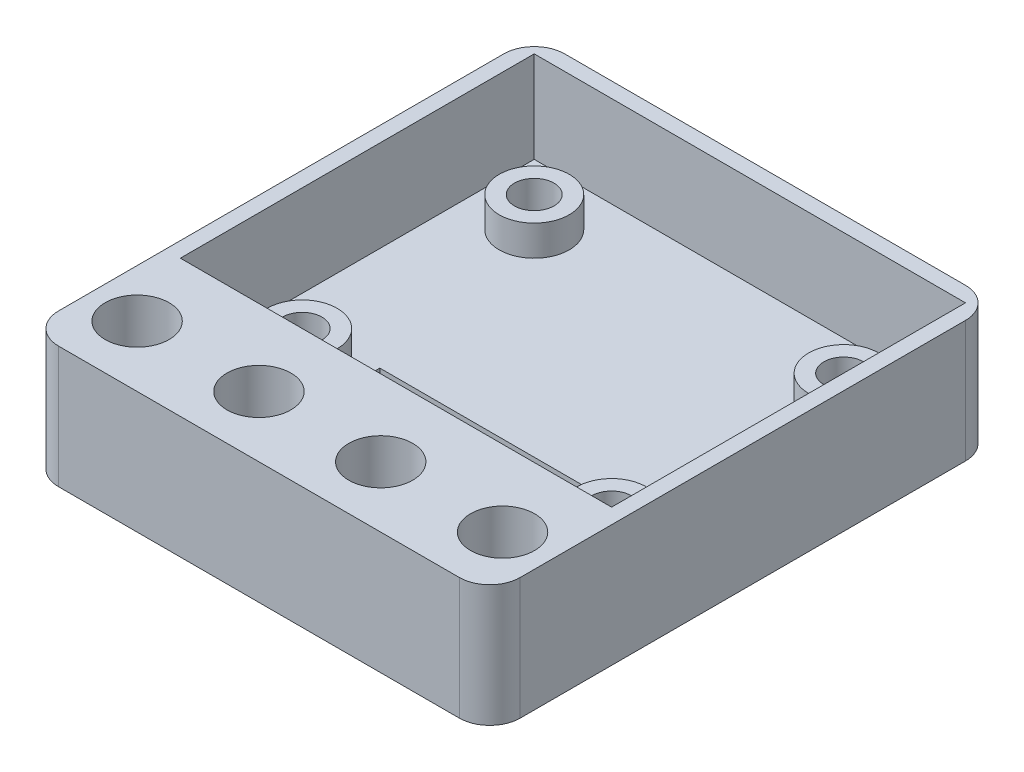
ISO-10303-21;
HEADER;
FILE_DESCRIPTION(('STEP AP214'),'2;1');
FILE_NAME('part.step','',(''),(''),'','','');
FILE_SCHEMA(('AUTOMOTIVE_DESIGN { 1 0 10303 214 1 1 1 1 }'));
ENDSEC;
DATA;
#1=APPLICATION_CONTEXT('core data for automotive mechanical design processes');
#2=APPLICATION_PROTOCOL_DEFINITION('international standard','automotive_design',2000,#1);
#3=PRODUCT_CONTEXT('',#1,'mechanical');
#4=PRODUCT('Part','Part','',(#3));
#5=PRODUCT_RELATED_PRODUCT_CATEGORY('part','',(#4));
#6=PRODUCT_DEFINITION_FORMATION('','',#4);
#7=PRODUCT_DEFINITION_CONTEXT('part definition',#1,'design');
#8=PRODUCT_DEFINITION('design','',#6,#7);
#9=PRODUCT_DEFINITION_SHAPE('','',#8);
#10=(LENGTH_UNIT() NAMED_UNIT(*) SI_UNIT(.MILLI.,.METRE.));
#11=(NAMED_UNIT(*) PLANE_ANGLE_UNIT() SI_UNIT($,.RADIAN.));
#12=(NAMED_UNIT(*) SI_UNIT($,.STERADIAN.) SOLID_ANGLE_UNIT());
#13=UNCERTAINTY_MEASURE_WITH_UNIT(LENGTH_MEASURE(1.E-05),#10,'distance_accuracy_value','');
#14=(GEOMETRIC_REPRESENTATION_CONTEXT(3) GLOBAL_UNCERTAINTY_ASSIGNED_CONTEXT((#13)) GLOBAL_UNIT_ASSIGNED_CONTEXT((#10,
#11,#12)) REPRESENTATION_CONTEXT('',''));
#15=CARTESIAN_POINT('',(0.,0.,0.));
#16=DIRECTION('',(0.,0.,1.));
#17=DIRECTION('',(1.,0.,0.));
#18=AXIS2_PLACEMENT_3D('',#15,#16,#17);
#19=CARTESIAN_POINT('',(0.,2.,9.92));
#20=DIRECTION('',(0.,0.,1.));
#21=DIRECTION('',(1.,0.,0.));
#22=AXIS2_PLACEMENT_3D('',#19,#20,#21);
#23=PLANE('',#22);
#24=DIRECTION('',(-1.,0.,0.));
#25=VECTOR('',#24,1.);
#26=CARTESIAN_POINT('',(0.,0.,9.92));
#27=LINE('',#26,#25);
#28=CARTESIAN_POINT('',(7.36,0.,9.92));
#29=VERTEX_POINT('',#28);
#30=CARTESIAN_POINT('',(-7.36,0.,9.92));
#31=VERTEX_POINT('',#30);
#32=EDGE_CURVE('E295',#29,#31,#27,.T.);
#33=ORIENTED_EDGE('',*,*,#32,.T.);
#34=DIRECTION('',(0.,-1.,0.));
#35=VECTOR('',#34,1.);
#36=CARTESIAN_POINT('',(-7.36,2.,9.92));
#37=LINE('',#36,#35);
#38=CARTESIAN_POINT('',(-7.36,2.,9.92));
#39=VERTEX_POINT('',#38);
#40=EDGE_CURVE('E367',#39,#31,#37,.T.);
#41=ORIENTED_EDGE('',*,*,#40,.F.);
#42=DIRECTION('',(-1.,0.,0.));
#43=VECTOR('',#42,1.);
#44=CARTESIAN_POINT('',(0.,2.,9.92));
#45=LINE('',#44,#43);
#46=CARTESIAN_POINT('',(7.36,2.,9.92));
#47=VERTEX_POINT('',#46);
#48=EDGE_CURVE('E329',#47,#39,#45,.T.);
#49=ORIENTED_EDGE('',*,*,#48,.F.);
#50=DIRECTION('',(0.,-1.,0.));
#51=VECTOR('',#50,1.);
#52=CARTESIAN_POINT('',(7.36,2.,9.92));
#53=LINE('',#52,#51);
#54=EDGE_CURVE('E344',#47,#29,#53,.T.);
#55=ORIENTED_EDGE('',*,*,#54,.T.);
#56=EDGE_LOOP('',(#33,#41,#49,#55));
#57=FACE_BOUND('',#56,.T.);
#58=ADVANCED_FACE('F41',(#57),#23,.F.);
#59=CARTESIAN_POINT('',(-7.36,2.,0.));
#60=DIRECTION('',(-1.,0.,0.));
#61=DIRECTION('',(0.,0.,1.));
#62=AXIS2_PLACEMENT_3D('',#59,#60,#61);
#63=PLANE('',#62);
#64=DIRECTION('',(0.,0.,-1.));
#65=VECTOR('',#64,1.);
#66=CARTESIAN_POINT('',(-7.36,0.,0.));
#67=LINE('',#66,#65);
#68=CARTESIAN_POINT('',(-7.36,0.,5.32));
#69=VERTEX_POINT('',#68);
#70=EDGE_CURVE('E348',#31,#69,#67,.T.);
#71=ORIENTED_EDGE('',*,*,#70,.T.);
#72=DIRECTION('',(0.,-1.,0.));
#73=VECTOR('',#72,1.);
#74=CARTESIAN_POINT('',(-7.36,2.,5.32));
#75=LINE('',#74,#73);
#76=CARTESIAN_POINT('',(-7.36,2.,5.32));
#77=VERTEX_POINT('',#76);
#78=EDGE_CURVE('E364',#77,#69,#75,.T.);
#79=ORIENTED_EDGE('',*,*,#78,.F.);
#80=DIRECTION('',(0.,0.,-1.));
#81=VECTOR('',#80,1.);
#82=CARTESIAN_POINT('',(-7.36,2.,0.));
#83=LINE('',#82,#81);
#84=EDGE_CURVE('E333',#39,#77,#83,.T.);
#85=ORIENTED_EDGE('',*,*,#84,.F.);
#86=ORIENTED_EDGE('',*,*,#40,.T.);
#87=EDGE_LOOP('',(#71,#79,#85,#86));
#88=FACE_BOUND('',#87,.T.);
#89=ADVANCED_FACE('F455',(#88),#63,.F.);
#90=CARTESIAN_POINT('',(0.,2.,5.32));
#91=DIRECTION('',(0.,0.,1.));
#92=DIRECTION('',(1.,0.,0.));
#93=AXIS2_PLACEMENT_3D('',#90,#91,#92);
#94=PLANE('',#93);
#95=DIRECTION('',(-1.,0.,0.));
#96=VECTOR('',#95,1.);
#97=CARTESIAN_POINT('',(0.,0.,5.32));
#98=LINE('',#97,#96);
#99=CARTESIAN_POINT('',(7.36,0.,5.32));
#100=VERTEX_POINT('',#99);
#101=EDGE_CURVE('E352',#100,#69,#98,.T.);
#102=ORIENTED_EDGE('',*,*,#101,.F.);
#103=DIRECTION('',(0.,-1.,0.));
#104=VECTOR('',#103,1.);
#105=CARTESIAN_POINT('',(7.36,2.,5.32));
#106=LINE('',#105,#104);
#107=CARTESIAN_POINT('',(7.36,2.,5.32));
#108=VERTEX_POINT('',#107);
#109=EDGE_CURVE('E361',#108,#100,#106,.T.);
#110=ORIENTED_EDGE('',*,*,#109,.F.);
#111=DIRECTION('',(-1.,0.,0.));
#112=VECTOR('',#111,1.);
#113=CARTESIAN_POINT('',(0.,2.,5.32));
#114=LINE('',#113,#112);
#115=EDGE_CURVE('E336',#108,#77,#114,.T.);
#116=ORIENTED_EDGE('',*,*,#115,.T.);
#117=ORIENTED_EDGE('',*,*,#78,.T.);
#118=EDGE_LOOP('',(#102,#110,#116,#117));
#119=FACE_BOUND('',#118,.T.);
#120=ADVANCED_FACE('F461',(#119),#94,.T.);
#121=CARTESIAN_POINT('',(7.36,2.,0.));
#122=DIRECTION('',(-1.,0.,0.));
#123=DIRECTION('',(0.,0.,1.));
#124=AXIS2_PLACEMENT_3D('',#121,#122,#123);
#125=PLANE('',#124);
#126=DIRECTION('',(0.,0.,-1.));
#127=VECTOR('',#126,1.);
#128=CARTESIAN_POINT('',(7.36,0.,0.));
#129=LINE('',#128,#127);
#130=EDGE_CURVE('E304',#29,#100,#129,.T.);
#131=ORIENTED_EDGE('',*,*,#130,.F.);
#132=ORIENTED_EDGE('',*,*,#54,.F.);
#133=DIRECTION('',(0.,0.,-1.));
#134=VECTOR('',#133,1.);
#135=CARTESIAN_POINT('',(7.36,2.,0.));
#136=LINE('',#135,#134);
#137=EDGE_CURVE('E340',#47,#108,#136,.T.);
#138=ORIENTED_EDGE('',*,*,#137,.T.);
#139=ORIENTED_EDGE('',*,*,#109,.T.);
#140=EDGE_LOOP('',(#131,#132,#138,#139));
#141=FACE_BOUND('',#140,.T.);
#142=ADVANCED_FACE('F467',(#141),#125,.T.);
#143=CARTESIAN_POINT('',(0.,2.,0.));
#144=DIRECTION('',(0.,1.,0.));
#145=DIRECTION('',(0.,0.,1.));
#146=AXIS2_PLACEMENT_3D('',#143,#144,#145);
#147=PLANE('',#146);
#148=CARTESIAN_POINT('',(10.16,2.,7.62));
#149=DIRECTION('',(0.,1.,0.));
#150=DIRECTION('',(0.,0.,1.));
#151=AXIS2_PLACEMENT_3D('',#148,#149,#150);
#152=CIRCLE('',#151,2.3);
#153=CARTESIAN_POINT('',(10.16,2.,9.92));
#154=VERTEX_POINT('',#153);
#155=EDGE_CURVE('E299',#154,#154,#152,.T.);
#156=ORIENTED_EDGE('',*,*,#155,.F.);
#157=EDGE_LOOP('',(#156));
#158=FACE_BOUND('',#157,.T.);
#159=CARTESIAN_POINT('',(10.16,2.,-7.62));
#160=DIRECTION('',(0.,1.,0.));
#161=DIRECTION('',(0.,0.,1.));
#162=AXIS2_PLACEMENT_3D('',#159,#160,#161);
#163=CIRCLE('',#162,2.3);
#164=CARTESIAN_POINT('',(10.16,2.,-5.32));
#165=VERTEX_POINT('',#164);
#166=EDGE_CURVE('E303',#165,#165,#163,.T.);
#167=ORIENTED_EDGE('',*,*,#166,.F.);
#168=EDGE_LOOP('',(#167));
#169=FACE_BOUND('',#168,.T.);
#170=CARTESIAN_POINT('',(-10.16,2.,7.62));
#171=DIRECTION('',(0.,1.,0.));
#172=DIRECTION('',(0.,0.,1.));
#173=AXIS2_PLACEMENT_3D('',#170,#171,#172);
#174=CIRCLE('',#173,2.3);
#175=CARTESIAN_POINT('',(-10.16,2.,9.92));
#176=VERTEX_POINT('',#175);
#177=EDGE_CURVE('E308',#176,#176,#174,.T.);
#178=ORIENTED_EDGE('',*,*,#177,.F.);
#179=EDGE_LOOP('',(#178));
#180=FACE_BOUND('',#179,.T.);
#181=CARTESIAN_POINT('',(-10.16,2.,-7.62));
#182=DIRECTION('',(0.,1.,0.));
#183=DIRECTION('',(0.,0.,1.));
#184=AXIS2_PLACEMENT_3D('',#181,#182,#183);
#185=CIRCLE('',#184,2.3);
#186=CARTESIAN_POINT('',(-10.16,2.,-5.32));
#187=VERTEX_POINT('',#186);
#188=EDGE_CURVE('E312',#187,#187,#185,.T.);
#189=ORIENTED_EDGE('',*,*,#188,.F.);
#190=EDGE_LOOP('',(#189));
#191=FACE_BOUND('',#190,.T.);
#192=DIRECTION('',(-1.,0.,0.));
#193=VECTOR('',#192,1.);
#194=CARTESIAN_POINT('',(0.,2.,11.62));
#195=LINE('',#194,#193);
#196=CARTESIAN_POINT('',(14.16,2.,11.62));
#197=VERTEX_POINT('',#196);
#198=CARTESIAN_POINT('',(-14.16,2.,11.62));
#199=VERTEX_POINT('',#198);
#200=EDGE_CURVE('E316',#197,#199,#195,.T.);
#201=ORIENTED_EDGE('',*,*,#200,.F.);
#202=DIRECTION('',(0.,0.,-1.));
#203=VECTOR('',#202,1.);
#204=CARTESIAN_POINT('',(14.16,2.,0.));
#205=LINE('',#204,#203);
#206=CARTESIAN_POINT('',(14.16,2.,-11.62));
#207=VERTEX_POINT('',#206);
#208=EDGE_CURVE('E164',#197,#207,#205,.T.);
#209=ORIENTED_EDGE('',*,*,#208,.T.);
#210=DIRECTION('',(-1.,0.,0.));
#211=VECTOR('',#210,1.);
#212=CARTESIAN_POINT('',(0.,2.,-11.62));
#213=LINE('',#212,#211);
#214=CARTESIAN_POINT('',(-14.16,2.,-11.62));
#215=VERTEX_POINT('',#214);
#216=EDGE_CURVE('E321',#207,#215,#213,.T.);
#217=ORIENTED_EDGE('',*,*,#216,.T.);
#218=DIRECTION('',(0.,0.,-1.));
#219=VECTOR('',#218,1.);
#220=CARTESIAN_POINT('',(-14.16,2.,0.));
#221=LINE('',#220,#219);
#222=EDGE_CURVE('E325',#199,#215,#221,.T.);
#223=ORIENTED_EDGE('',*,*,#222,.F.);
#224=EDGE_LOOP('',(#201,#209,#217,#223));
#225=FACE_BOUND('',#224,.T.);
#226=ORIENTED_EDGE('',*,*,#48,.T.);
#227=ORIENTED_EDGE('',*,*,#84,.T.);
#228=ORIENTED_EDGE('',*,*,#115,.F.);
#229=ORIENTED_EDGE('',*,*,#137,.F.);
#230=EDGE_LOOP('',(#226,#227,#228,#229));
#231=FACE_BOUND('',#230,.T.);
#232=ADVANCED_FACE('F471',(#158,#169,#180,#191,#225,#231),#147,.T.);
#233=CARTESIAN_POINT('',(0.,0.,0.));
#234=DIRECTION('',(0.,1.,0.));
#235=DIRECTION('',(0.,0.,1.));
#236=AXIS2_PLACEMENT_3D('',#233,#234,#235);
#237=PLANE('',#236);
#238=ORIENTED_EDGE('',*,*,#32,.F.);
#239=ORIENTED_EDGE('',*,*,#130,.T.);
#240=ORIENTED_EDGE('',*,*,#101,.T.);
#241=ORIENTED_EDGE('',*,*,#70,.F.);
#242=EDGE_LOOP('',(#238,#239,#240,#241));
#243=FACE_BOUND('',#242,.T.);
#244=CARTESIAN_POINT('',(-10.16,0.,7.62));
#245=DIRECTION('',(0.,1.,0.));
#246=DIRECTION('',(0.,0.,1.));
#247=AXIS2_PLACEMENT_3D('',#244,#245,#246);
#248=CIRCLE('',#247,1.3);
#249=CARTESIAN_POINT('',(-10.16,0.,8.92));
#250=VERTEX_POINT('',#249);
#251=EDGE_CURVE('E283',#250,#250,#248,.T.);
#252=ORIENTED_EDGE('',*,*,#251,.T.);
#253=EDGE_LOOP('',(#252));
#254=FACE_BOUND('',#253,.T.);
#255=CARTESIAN_POINT('',(10.16,0.,7.62));
#256=DIRECTION('',(0.,1.,0.));
#257=DIRECTION('',(0.,0.,1.));
#258=AXIS2_PLACEMENT_3D('',#255,#256,#257);
#259=CIRCLE('',#258,1.3);
#260=CARTESIAN_POINT('',(10.16,0.,8.92));
#261=VERTEX_POINT('',#260);
#262=EDGE_CURVE('E271',#261,#261,#259,.T.);
#263=ORIENTED_EDGE('',*,*,#262,.T.);
#264=EDGE_LOOP('',(#263));
#265=FACE_BOUND('',#264,.T.);
#266=CARTESIAN_POINT('',(10.16,0.,-7.62));
#267=DIRECTION('',(0.,1.,0.));
#268=DIRECTION('',(0.,0.,1.));
#269=AXIS2_PLACEMENT_3D('',#266,#267,#268);
#270=CIRCLE('',#269,1.3);
#271=CARTESIAN_POINT('',(10.16,0.,-6.32));
#272=VERTEX_POINT('',#271);
#273=EDGE_CURVE('E259',#272,#272,#270,.T.);
#274=ORIENTED_EDGE('',*,*,#273,.T.);
#275=EDGE_LOOP('',(#274));
#276=FACE_BOUND('',#275,.T.);
#277=CARTESIAN_POINT('',(-10.16,0.,-7.62));
#278=DIRECTION('',(0.,1.,0.));
#279=DIRECTION('',(0.,0.,1.));
#280=AXIS2_PLACEMENT_3D('',#277,#278,#279);
#281=CIRCLE('',#280,1.3);
#282=CARTESIAN_POINT('',(-10.16,0.,-6.32));
#283=VERTEX_POINT('',#282);
#284=EDGE_CURVE('E168',#283,#283,#281,.T.);
#285=ORIENTED_EDGE('',*,*,#284,.T.);
#286=EDGE_LOOP('',(#285));
#287=FACE_BOUND('',#286,.T.);
#288=CARTESIAN_POINT('',(12.,0.,16.62));
#289=DIRECTION('',(0.,1.,0.));
#290=DIRECTION('',(0.,0.,1.));
#291=AXIS2_PLACEMENT_3D('',#288,#289,#290);
#292=CIRCLE('',#291,2.1);
#293=CARTESIAN_POINT('',(12.,0.,18.72));
#294=VERTEX_POINT('',#293);
#295=EDGE_CURVE('E211',#294,#294,#292,.T.);
#296=ORIENTED_EDGE('',*,*,#295,.T.);
#297=EDGE_LOOP('',(#296));
#298=FACE_BOUND('',#297,.T.);
#299=CARTESIAN_POINT('',(4.,0.,16.62));
#300=DIRECTION('',(0.,1.,0.));
#301=DIRECTION('',(0.,0.,1.));
#302=AXIS2_PLACEMENT_3D('',#299,#300,#301);
#303=CIRCLE('',#302,2.1);
#304=CARTESIAN_POINT('',(4.,0.,18.72));
#305=VERTEX_POINT('',#304);
#306=EDGE_CURVE('E215',#305,#305,#303,.T.);
#307=ORIENTED_EDGE('',*,*,#306,.T.);
#308=EDGE_LOOP('',(#307));
#309=FACE_BOUND('',#308,.T.);
#310=CARTESIAN_POINT('',(-4.,0.,16.62));
#311=DIRECTION('',(0.,1.,0.));
#312=DIRECTION('',(0.,0.,1.));
#313=AXIS2_PLACEMENT_3D('',#310,#311,#312);
#314=CIRCLE('',#313,2.1);
#315=CARTESIAN_POINT('',(-4.,0.,18.72));
#316=VERTEX_POINT('',#315);
#317=EDGE_CURVE('E219',#316,#316,#314,.T.);
#318=ORIENTED_EDGE('',*,*,#317,.T.);
#319=EDGE_LOOP('',(#318));
#320=FACE_BOUND('',#319,.T.);
#321=CARTESIAN_POINT('',(-12.,0.,16.62));
#322=DIRECTION('',(0.,1.,0.));
#323=DIRECTION('',(0.,0.,1.));
#324=AXIS2_PLACEMENT_3D('',#321,#322,#323);
#325=CIRCLE('',#324,2.1);
#326=CARTESIAN_POINT('',(-12.,0.,18.72));
#327=VERTEX_POINT('',#326);
#328=EDGE_CURVE('E223',#327,#327,#325,.T.);
#329=ORIENTED_EDGE('',*,*,#328,.T.);
#330=EDGE_LOOP('',(#329));
#331=FACE_BOUND('',#330,.T.);
#332=DIRECTION('',(0.,0.,-1.));
#333=VECTOR('',#332,1.);
#334=CARTESIAN_POINT('',(15.16,0.,0.));
#335=LINE('',#334,#333);
#336=CARTESIAN_POINT('',(15.16,0.,18.62));
#337=VERTEX_POINT('',#336);
#338=CARTESIAN_POINT('',(15.16,0.,-10.62));
#339=VERTEX_POINT('',#338);
#340=EDGE_CURVE('E231',#337,#339,#335,.T.);
#341=ORIENTED_EDGE('',*,*,#340,.F.);
#342=CARTESIAN_POINT('',(13.16,0.,18.62));
#343=DIRECTION('',(0.,1.,0.));
#344=DIRECTION('',(0.,0.,1.));
#345=AXIS2_PLACEMENT_3D('',#342,#343,#344);
#346=CIRCLE('',#345,2.);
#347=CARTESIAN_POINT('',(13.16,0.,20.62));
#348=VERTEX_POINT('',#347);
#349=EDGE_CURVE('E387',#337,#348,#346,.F.);
#350=ORIENTED_EDGE('',*,*,#349,.T.);
#351=DIRECTION('',(1.,0.,0.));
#352=VECTOR('',#351,1.);
#353=CARTESIAN_POINT('',(0.,0.,20.62));
#354=LINE('',#353,#352);
#355=CARTESIAN_POINT('',(-13.16,0.,20.62));
#356=VERTEX_POINT('',#355);
#357=EDGE_CURVE('E227',#356,#348,#354,.T.);
#358=ORIENTED_EDGE('',*,*,#357,.F.);
#359=CARTESIAN_POINT('',(-13.16,0.,18.62));
#360=DIRECTION('',(0.,1.,0.));
#361=DIRECTION('',(0.,0.,1.));
#362=AXIS2_PLACEMENT_3D('',#359,#360,#361);
#363=CIRCLE('',#362,2.);
#364=CARTESIAN_POINT('',(-15.16,0.,18.62));
#365=VERTEX_POINT('',#364);
#366=EDGE_CURVE('E378',#356,#365,#363,.F.);
#367=ORIENTED_EDGE('',*,*,#366,.T.);
#368=DIRECTION('',(0.,0.,-1.));
#369=VECTOR('',#368,1.);
#370=CARTESIAN_POINT('',(-15.16,0.,0.));
#371=LINE('',#370,#369);
#372=CARTESIAN_POINT('',(-15.16,0.,-10.62));
#373=VERTEX_POINT('',#372);
#374=EDGE_CURVE('E239',#365,#373,#371,.T.);
#375=ORIENTED_EDGE('',*,*,#374,.T.);
#376=CARTESIAN_POINT('',(-13.16,0.,-10.62));
#377=DIRECTION('',(0.,1.,0.));
#378=DIRECTION('',(0.,0.,1.));
#379=AXIS2_PLACEMENT_3D('',#376,#377,#378);
#380=CIRCLE('',#379,2.);
#381=CARTESIAN_POINT('',(-13.16,0.,-12.62));
#382=VERTEX_POINT('',#381);
#383=EDGE_CURVE('E381',#373,#382,#380,.F.);
#384=ORIENTED_EDGE('',*,*,#383,.T.);
#385=DIRECTION('',(-1.,0.,0.));
#386=VECTOR('',#385,1.);
#387=CARTESIAN_POINT('',(0.,0.,-12.62));
#388=LINE('',#387,#386);
#389=CARTESIAN_POINT('',(13.16,0.,-12.62));
#390=VERTEX_POINT('',#389);
#391=EDGE_CURVE('E235',#390,#382,#388,.T.);
#392=ORIENTED_EDGE('',*,*,#391,.F.);
#393=CARTESIAN_POINT('',(13.16,0.,-10.62));
#394=DIRECTION('',(0.,1.,0.));
#395=DIRECTION('',(0.,0.,1.));
#396=AXIS2_PLACEMENT_3D('',#393,#394,#395);
#397=CIRCLE('',#396,2.);
#398=EDGE_CURVE('E384',#390,#339,#397,.F.);
#399=ORIENTED_EDGE('',*,*,#398,.T.);
#400=EDGE_LOOP('',(#341,#350,#358,#367,#375,#384,#392,#399));
#401=FACE_BOUND('',#400,.T.);
#402=ADVANCED_FACE('F425',(#243,#254,#265,#276,#287,#298,#309,#320,#331,#401),#237,.F.);
#403=CARTESIAN_POINT('',(-10.16,4.,7.62));
#404=DIRECTION('',(0.,-1.,0.));
#405=DIRECTION('',(0.,0.,-1.));
#406=AXIS2_PLACEMENT_3D('',#403,#404,#405);
#407=CYLINDRICAL_SURFACE('',#406,1.3);
#408=CARTESIAN_POINT('',(-10.16,4.,7.62));
#409=DIRECTION('',(0.,1.,0.));
#410=DIRECTION('',(0.,0.,1.));
#411=AXIS2_PLACEMENT_3D('',#408,#409,#410);
#412=CIRCLE('',#411,1.3);
#413=CARTESIAN_POINT('',(-10.16,4.,8.92));
#414=VERTEX_POINT('',#413);
#415=EDGE_CURVE('E287',#414,#414,#412,.T.);
#416=ORIENTED_EDGE('',*,*,#415,.T.);
#417=EDGE_LOOP('',(#416));
#418=FACE_BOUND('',#417,.T.);
#419=ORIENTED_EDGE('',*,*,#251,.F.);
#420=EDGE_LOOP('',(#419));
#421=FACE_BOUND('',#420,.T.);
#422=ADVANCED_FACE('F475',(#418,#421),#407,.F.);
#423=CARTESIAN_POINT('',(-10.16,4.,7.62));
#424=DIRECTION('',(0.,-1.,0.));
#425=DIRECTION('',(0.,0.,-1.));
#426=AXIS2_PLACEMENT_3D('',#423,#424,#425);
#427=CYLINDRICAL_SURFACE('',#426,2.3);
#428=ORIENTED_EDGE('',*,*,#177,.T.);
#429=EDGE_LOOP('',(#428));
#430=FACE_BOUND('',#429,.T.);
#431=CARTESIAN_POINT('',(-10.16,4.,7.62));
#432=DIRECTION('',(0.,1.,0.));
#433=DIRECTION('',(0.,0.,1.));
#434=AXIS2_PLACEMENT_3D('',#431,#432,#433);
#435=CIRCLE('',#434,2.3);
#436=CARTESIAN_POINT('',(-10.16,4.,9.92));
#437=VERTEX_POINT('',#436);
#438=EDGE_CURVE('E291',#437,#437,#435,.T.);
#439=ORIENTED_EDGE('',*,*,#438,.F.);
#440=EDGE_LOOP('',(#439));
#441=FACE_BOUND('',#440,.T.);
#442=ADVANCED_FACE('F482',(#430,#441),#427,.T.);
#443=CARTESIAN_POINT('',(0.,4.,0.));
#444=DIRECTION('',(0.,1.,0.));
#445=DIRECTION('',(0.,0.,1.));
#446=AXIS2_PLACEMENT_3D('',#443,#444,#445);
#447=PLANE('',#446);
#448=ORIENTED_EDGE('',*,*,#415,.F.);
#449=EDGE_LOOP('',(#448));
#450=FACE_BOUND('',#449,.T.);
#451=ORIENTED_EDGE('',*,*,#438,.T.);
#452=EDGE_LOOP('',(#451));
#453=FACE_BOUND('',#452,.T.);
#454=ADVANCED_FACE('F486',(#450,#453),#447,.T.);
#455=CARTESIAN_POINT('',(10.16,4.,7.62));
#456=DIRECTION('',(0.,-1.,0.));
#457=DIRECTION('',(0.,0.,-1.));
#458=AXIS2_PLACEMENT_3D('',#455,#456,#457);
#459=CYLINDRICAL_SURFACE('',#458,1.3);
#460=CARTESIAN_POINT('',(10.16,4.,7.62));
#461=DIRECTION('',(0.,1.,0.));
#462=DIRECTION('',(0.,0.,1.));
#463=AXIS2_PLACEMENT_3D('',#460,#461,#462);
#464=CIRCLE('',#463,1.3);
#465=CARTESIAN_POINT('',(10.16,4.,8.92));
#466=VERTEX_POINT('',#465);
#467=EDGE_CURVE('E275',#466,#466,#464,.T.);
#468=ORIENTED_EDGE('',*,*,#467,.T.);
#469=EDGE_LOOP('',(#468));
#470=FACE_BOUND('',#469,.T.);
#471=ORIENTED_EDGE('',*,*,#262,.F.);
#472=EDGE_LOOP('',(#471));
#473=FACE_BOUND('',#472,.T.);
#474=ADVANCED_FACE('F490',(#470,#473),#459,.F.);
#475=CARTESIAN_POINT('',(10.16,4.,7.62));
#476=DIRECTION('',(0.,-1.,0.));
#477=DIRECTION('',(0.,0.,-1.));
#478=AXIS2_PLACEMENT_3D('',#475,#476,#477);
#479=CYLINDRICAL_SURFACE('',#478,2.3);
#480=ORIENTED_EDGE('',*,*,#155,.T.);
#481=EDGE_LOOP('',(#480));
#482=FACE_BOUND('',#481,.T.);
#483=CARTESIAN_POINT('',(10.16,4.,7.62));
#484=DIRECTION('',(0.,1.,0.));
#485=DIRECTION('',(0.,0.,1.));
#486=AXIS2_PLACEMENT_3D('',#483,#484,#485);
#487=CIRCLE('',#486,2.3);
#488=CARTESIAN_POINT('',(10.16,4.,9.92));
#489=VERTEX_POINT('',#488);
#490=EDGE_CURVE('E279',#489,#489,#487,.T.);
#491=ORIENTED_EDGE('',*,*,#490,.F.);
#492=EDGE_LOOP('',(#491));
#493=FACE_BOUND('',#492,.T.);
#494=ADVANCED_FACE('F494',(#482,#493),#479,.T.);
#495=CARTESIAN_POINT('',(0.,4.,0.));
#496=DIRECTION('',(0.,1.,0.));
#497=DIRECTION('',(0.,0.,1.));
#498=AXIS2_PLACEMENT_3D('',#495,#496,#497);
#499=PLANE('',#498);
#500=ORIENTED_EDGE('',*,*,#467,.F.);
#501=EDGE_LOOP('',(#500));
#502=FACE_BOUND('',#501,.T.);
#503=ORIENTED_EDGE('',*,*,#490,.T.);
#504=EDGE_LOOP('',(#503));
#505=FACE_BOUND('',#504,.T.);
#506=ADVANCED_FACE('F498',(#502,#505),#499,.T.);
#507=CARTESIAN_POINT('',(10.16,4.,-7.62));
#508=DIRECTION('',(0.,-1.,0.));
#509=DIRECTION('',(0.,0.,-1.));
#510=AXIS2_PLACEMENT_3D('',#507,#508,#509);
#511=CYLINDRICAL_SURFACE('',#510,1.3);
#512=CARTESIAN_POINT('',(10.16,4.,-7.62));
#513=DIRECTION('',(0.,1.,0.));
#514=DIRECTION('',(0.,0.,1.));
#515=AXIS2_PLACEMENT_3D('',#512,#513,#514);
#516=CIRCLE('',#515,1.3);
#517=CARTESIAN_POINT('',(10.16,4.,-6.32));
#518=VERTEX_POINT('',#517);
#519=EDGE_CURVE('E263',#518,#518,#516,.T.);
#520=ORIENTED_EDGE('',*,*,#519,.T.);
#521=EDGE_LOOP('',(#520));
#522=FACE_BOUND('',#521,.T.);
#523=ORIENTED_EDGE('',*,*,#273,.F.);
#524=EDGE_LOOP('',(#523));
#525=FACE_BOUND('',#524,.T.);
#526=ADVANCED_FACE('F502',(#522,#525),#511,.F.);
#527=CARTESIAN_POINT('',(10.16,4.,-7.62));
#528=DIRECTION('',(0.,-1.,0.));
#529=DIRECTION('',(0.,0.,-1.));
#530=AXIS2_PLACEMENT_3D('',#527,#528,#529);
#531=CYLINDRICAL_SURFACE('',#530,2.3);
#532=ORIENTED_EDGE('',*,*,#166,.T.);
#533=EDGE_LOOP('',(#532));
#534=FACE_BOUND('',#533,.T.);
#535=CARTESIAN_POINT('',(10.16,4.,-7.62));
#536=DIRECTION('',(0.,1.,0.));
#537=DIRECTION('',(0.,0.,1.));
#538=AXIS2_PLACEMENT_3D('',#535,#536,#537);
#539=CIRCLE('',#538,2.3);
#540=CARTESIAN_POINT('',(10.16,4.,-5.32));
#541=VERTEX_POINT('',#540);
#542=EDGE_CURVE('E267',#541,#541,#539,.T.);
#543=ORIENTED_EDGE('',*,*,#542,.F.);
#544=EDGE_LOOP('',(#543));
#545=FACE_BOUND('',#544,.T.);
#546=ADVANCED_FACE('F506',(#534,#545),#531,.T.);
#547=CARTESIAN_POINT('',(0.,4.,0.));
#548=DIRECTION('',(0.,1.,0.));
#549=DIRECTION('',(0.,0.,1.));
#550=AXIS2_PLACEMENT_3D('',#547,#548,#549);
#551=PLANE('',#550);
#552=ORIENTED_EDGE('',*,*,#519,.F.);
#553=EDGE_LOOP('',(#552));
#554=FACE_BOUND('',#553,.T.);
#555=ORIENTED_EDGE('',*,*,#542,.T.);
#556=EDGE_LOOP('',(#555));
#557=FACE_BOUND('',#556,.T.);
#558=ADVANCED_FACE('F510',(#554,#557),#551,.T.);
#559=CARTESIAN_POINT('',(-10.16,4.,-7.62));
#560=DIRECTION('',(0.,-1.,0.));
#561=DIRECTION('',(0.,0.,-1.));
#562=AXIS2_PLACEMENT_3D('',#559,#560,#561);
#563=CYLINDRICAL_SURFACE('',#562,1.3);
#564=CARTESIAN_POINT('',(-10.16,4.,-7.62));
#565=DIRECTION('',(0.,1.,0.));
#566=DIRECTION('',(0.,0.,1.));
#567=AXIS2_PLACEMENT_3D('',#564,#565,#566);
#568=CIRCLE('',#567,1.3);
#569=CARTESIAN_POINT('',(-10.16,4.,-6.32));
#570=VERTEX_POINT('',#569);
#571=EDGE_CURVE('E251',#570,#570,#568,.T.);
#572=ORIENTED_EDGE('',*,*,#571,.T.);
#573=EDGE_LOOP('',(#572));
#574=FACE_BOUND('',#573,.T.);
#575=ORIENTED_EDGE('',*,*,#284,.F.);
#576=EDGE_LOOP('',(#575));
#577=FACE_BOUND('',#576,.T.);
#578=ADVANCED_FACE('F514',(#574,#577),#563,.F.);
#579=CARTESIAN_POINT('',(-10.16,4.,-7.62));
#580=DIRECTION('',(0.,-1.,0.));
#581=DIRECTION('',(0.,0.,-1.));
#582=AXIS2_PLACEMENT_3D('',#579,#580,#581);
#583=CYLINDRICAL_SURFACE('',#582,2.3);
#584=ORIENTED_EDGE('',*,*,#188,.T.);
#585=EDGE_LOOP('',(#584));
#586=FACE_BOUND('',#585,.T.);
#587=CARTESIAN_POINT('',(-10.16,4.,-7.62));
#588=DIRECTION('',(0.,1.,0.));
#589=DIRECTION('',(0.,0.,1.));
#590=AXIS2_PLACEMENT_3D('',#587,#588,#589);
#591=CIRCLE('',#590,2.3);
#592=CARTESIAN_POINT('',(-10.16,4.,-5.32));
#593=VERTEX_POINT('',#592);
#594=EDGE_CURVE('E255',#593,#593,#591,.T.);
#595=ORIENTED_EDGE('',*,*,#594,.F.);
#596=EDGE_LOOP('',(#595));
#597=FACE_BOUND('',#596,.T.);
#598=ADVANCED_FACE('F518',(#586,#597),#583,.T.);
#599=CARTESIAN_POINT('',(0.,4.,0.));
#600=DIRECTION('',(0.,1.,0.));
#601=DIRECTION('',(0.,0.,1.));
#602=AXIS2_PLACEMENT_3D('',#599,#600,#601);
#603=PLANE('',#602);
#604=ORIENTED_EDGE('',*,*,#571,.F.);
#605=EDGE_LOOP('',(#604));
#606=FACE_BOUND('',#605,.T.);
#607=ORIENTED_EDGE('',*,*,#594,.T.);
#608=EDGE_LOOP('',(#607));
#609=FACE_BOUND('',#608,.T.);
#610=ADVANCED_FACE('F522',(#606,#609),#603,.T.);
#611=CARTESIAN_POINT('',(0.,8.,20.62));
#612=DIRECTION('',(0.,0.,-1.));
#613=DIRECTION('',(-1.,0.,0.));
#614=AXIS2_PLACEMENT_3D('',#611,#612,#613);
#615=PLANE('',#614);
#616=ORIENTED_EDGE('',*,*,#357,.T.);
#617=DIRECTION('',(0.,-1.,0.));
#618=VECTOR('',#617,1.);
#619=CARTESIAN_POINT('',(13.16,8.,20.62));
#620=LINE('',#619,#618);
#621=CARTESIAN_POINT('',(13.16,8.,20.62));
#622=VERTEX_POINT('',#621);
#623=EDGE_CURVE('E394',#348,#622,#620,.F.);
#624=ORIENTED_EDGE('',*,*,#623,.T.);
#625=DIRECTION('',(1.,0.,0.));
#626=VECTOR('',#625,1.);
#627=CARTESIAN_POINT('',(0.,8.,20.62));
#628=LINE('',#627,#626);
#629=CARTESIAN_POINT('',(-13.16,8.,20.62));
#630=VERTEX_POINT('',#629);
#631=EDGE_CURVE('E196',#630,#622,#628,.T.);
#632=ORIENTED_EDGE('',*,*,#631,.F.);
#633=DIRECTION('',(0.,-1.,0.));
#634=VECTOR('',#633,1.);
#635=CARTESIAN_POINT('',(-13.16,0.,20.62));
#636=LINE('',#635,#634);
#637=EDGE_CURVE('E390',#630,#356,#636,.T.);
#638=ORIENTED_EDGE('',*,*,#637,.T.);
#639=EDGE_LOOP('',(#616,#624,#632,#638));
#640=FACE_BOUND('',#639,.T.);
#641=ADVANCED_FACE('F436',(#640),#615,.F.);
#642=CARTESIAN_POINT('',(15.16,8.,0.));
#643=DIRECTION('',(-1.,0.,0.));
#644=DIRECTION('',(0.,0.,1.));
#645=AXIS2_PLACEMENT_3D('',#642,#643,#644);
#646=PLANE('',#645);
#647=DIRECTION('',(0.,0.,-1.));
#648=VECTOR('',#647,1.);
#649=CARTESIAN_POINT('',(15.16,8.,0.));
#650=LINE('',#649,#648);
#651=CARTESIAN_POINT('',(15.16,8.,18.62));
#652=VERTEX_POINT('',#651);
#653=CARTESIAN_POINT('',(15.16,8.,-10.62));
#654=VERTEX_POINT('',#653);
#655=EDGE_CURVE('E200',#652,#654,#650,.T.);
#656=ORIENTED_EDGE('',*,*,#655,.F.);
#657=DIRECTION('',(0.,-1.,0.));
#658=VECTOR('',#657,1.);
#659=CARTESIAN_POINT('',(15.16,8.,18.62));
#660=LINE('',#659,#658);
#661=EDGE_CURVE('E374',#652,#337,#660,.T.);
#662=ORIENTED_EDGE('',*,*,#661,.T.);
#663=ORIENTED_EDGE('',*,*,#340,.T.);
#664=DIRECTION('',(0.,-1.,0.));
#665=VECTOR('',#664,1.);
#666=CARTESIAN_POINT('',(15.16,8.,-10.62));
#667=LINE('',#666,#665);
#668=EDGE_CURVE('E371',#339,#654,#667,.F.);
#669=ORIENTED_EDGE('',*,*,#668,.T.);
#670=EDGE_LOOP('',(#656,#662,#663,#669));
#671=FACE_BOUND('',#670,.T.);
#672=ADVANCED_FACE('F444',(#671),#646,.F.);
#673=CARTESIAN_POINT('',(0.,8.,-12.62));
#674=DIRECTION('',(0.,0.,1.));
#675=DIRECTION('',(1.,0.,0.));
#676=AXIS2_PLACEMENT_3D('',#673,#674,#675);
#677=PLANE('',#676);
#678=DIRECTION('',(-1.,0.,0.));
#679=VECTOR('',#678,1.);
#680=CARTESIAN_POINT('',(0.,8.,-12.62));
#681=LINE('',#680,#679);
#682=CARTESIAN_POINT('',(13.16,8.,-12.62));
#683=VERTEX_POINT('',#682);
#684=CARTESIAN_POINT('',(-13.16,8.,-12.62));
#685=VERTEX_POINT('',#684);
#686=EDGE_CURVE('E204',#683,#685,#681,.T.);
#687=ORIENTED_EDGE('',*,*,#686,.F.);
#688=DIRECTION('',(0.,-1.,0.));
#689=VECTOR('',#688,1.);
#690=CARTESIAN_POINT('',(13.16,8.,-12.62));
#691=LINE('',#690,#689);
#692=EDGE_CURVE('E411',#683,#390,#691,.T.);
#693=ORIENTED_EDGE('',*,*,#692,.T.);
#694=ORIENTED_EDGE('',*,*,#391,.T.);
#695=DIRECTION('',(0.,-1.,0.));
#696=VECTOR('',#695,1.);
#697=CARTESIAN_POINT('',(-13.16,8.,-12.62));
#698=LINE('',#697,#696);
#699=EDGE_CURVE('E408',#382,#685,#698,.F.);
#700=ORIENTED_EDGE('',*,*,#699,.T.);
#701=EDGE_LOOP('',(#687,#693,#694,#700));
#702=FACE_BOUND('',#701,.T.);
#703=ADVANCED_FACE('F419',(#702),#677,.F.);
#704=CARTESIAN_POINT('',(14.16,8.,0.));
#705=DIRECTION('',(-1.,0.,0.));
#706=DIRECTION('',(0.,0.,1.));
#707=AXIS2_PLACEMENT_3D('',#704,#705,#706);
#708=PLANE('',#707);
#709=DIRECTION('',(0.,-1.,0.));
#710=VECTOR('',#709,1.);
#711=CARTESIAN_POINT('',(14.16,8.,-11.62));
#712=LINE('',#711,#710);
#713=CARTESIAN_POINT('',(14.16,8.,-11.62));
#714=VERTEX_POINT('',#713);
#715=EDGE_CURVE('E210',#714,#207,#712,.T.);
#716=ORIENTED_EDGE('',*,*,#715,.T.);
#717=ORIENTED_EDGE('',*,*,#208,.F.);
#718=DIRECTION('',(0.,-1.,0.));
#719=VECTOR('',#718,1.);
#720=CARTESIAN_POINT('',(14.16,8.,11.62));
#721=LINE('',#720,#719);
#722=CARTESIAN_POINT('',(14.16,8.,11.62));
#723=VERTEX_POINT('',#722);
#724=EDGE_CURVE('E156',#723,#197,#721,.T.);
#725=ORIENTED_EDGE('',*,*,#724,.F.);
#726=DIRECTION('',(0.,0.,-1.));
#727=VECTOR('',#726,1.);
#728=CARTESIAN_POINT('',(14.16,8.,0.));
#729=LINE('',#728,#727);
#730=EDGE_CURVE('E161',#723,#714,#729,.T.);
#731=ORIENTED_EDGE('',*,*,#730,.T.);
#732=EDGE_LOOP('',(#716,#717,#725,#731));
#733=FACE_BOUND('',#732,.T.);
#734=ADVANCED_FACE('F159',(#733),#708,.T.);
#735=CARTESIAN_POINT('',(0.,8.,11.62));
#736=DIRECTION('',(0.,0.,1.));
#737=DIRECTION('',(1.,0.,0.));
#738=AXIS2_PLACEMENT_3D('',#735,#736,#737);
#739=PLANE('',#738);
#740=ORIENTED_EDGE('',*,*,#200,.T.);
#741=DIRECTION('',(0.,-1.,0.));
#742=VECTOR('',#741,1.);
#743=CARTESIAN_POINT('',(-14.16,8.,11.62));
#744=LINE('',#743,#742);
#745=CARTESIAN_POINT('',(-14.16,8.,11.62));
#746=VERTEX_POINT('',#745);
#747=EDGE_CURVE('E169',#746,#199,#744,.T.);
#748=ORIENTED_EDGE('',*,*,#747,.F.);
#749=DIRECTION('',(-1.,0.,0.));
#750=VECTOR('',#749,1.);
#751=CARTESIAN_POINT('',(0.,8.,11.62));
#752=LINE('',#751,#750);
#753=EDGE_CURVE('E173',#723,#746,#752,.T.);
#754=ORIENTED_EDGE('',*,*,#753,.F.);
#755=ORIENTED_EDGE('',*,*,#724,.T.);
#756=EDGE_LOOP('',(#740,#748,#754,#755));
#757=FACE_BOUND('',#756,.T.);
#758=ADVANCED_FACE('F174',(#757),#739,.F.);
#759=CARTESIAN_POINT('',(-14.16,8.,0.));
#760=DIRECTION('',(-1.,0.,0.));
#761=DIRECTION('',(0.,0.,1.));
#762=AXIS2_PLACEMENT_3D('',#759,#760,#761);
#763=PLANE('',#762);
#764=ORIENTED_EDGE('',*,*,#222,.T.);
#765=DIRECTION('',(0.,-1.,0.));
#766=VECTOR('',#765,1.);
#767=CARTESIAN_POINT('',(-14.16,8.,-11.62));
#768=LINE('',#767,#766);
#769=CARTESIAN_POINT('',(-14.16,8.,-11.62));
#770=VERTEX_POINT('',#769);
#771=EDGE_CURVE('E246',#770,#215,#768,.T.);
#772=ORIENTED_EDGE('',*,*,#771,.F.);
#773=DIRECTION('',(0.,0.,-1.));
#774=VECTOR('',#773,1.);
#775=CARTESIAN_POINT('',(-14.16,8.,0.));
#776=LINE('',#775,#774);
#777=EDGE_CURVE('E178',#746,#770,#776,.T.);
#778=ORIENTED_EDGE('',*,*,#777,.F.);
#779=ORIENTED_EDGE('',*,*,#747,.T.);
#780=EDGE_LOOP('',(#764,#772,#778,#779));
#781=FACE_BOUND('',#780,.T.);
#782=ADVANCED_FACE('F548',(#781),#763,.F.);
#783=CARTESIAN_POINT('',(0.,8.,-11.62));
#784=DIRECTION('',(0.,0.,1.));
#785=DIRECTION('',(1.,0.,0.));
#786=AXIS2_PLACEMENT_3D('',#783,#784,#785);
#787=PLANE('',#786);
#788=ORIENTED_EDGE('',*,*,#771,.T.);
#789=ORIENTED_EDGE('',*,*,#216,.F.);
#790=ORIENTED_EDGE('',*,*,#715,.F.);
#791=DIRECTION('',(-1.,0.,0.));
#792=VECTOR('',#791,1.);
#793=CARTESIAN_POINT('',(0.,8.,-11.62));
#794=LINE('',#793,#792);
#795=EDGE_CURVE('E182',#714,#770,#794,.T.);
#796=ORIENTED_EDGE('',*,*,#795,.T.);
#797=EDGE_LOOP('',(#788,#789,#790,#796));
#798=FACE_BOUND('',#797,.T.);
#799=ADVANCED_FACE('F542',(#798),#787,.T.);
#800=CARTESIAN_POINT('',(-12.,8.,16.62));
#801=DIRECTION('',(0.,-1.,0.));
#802=DIRECTION('',(0.,0.,-1.));
#803=AXIS2_PLACEMENT_3D('',#800,#801,#802);
#804=CYLINDRICAL_SURFACE('',#803,2.1);
#805=CARTESIAN_POINT('',(-12.,8.,16.62));
#806=DIRECTION('',(0.,1.,0.));
#807=DIRECTION('',(0.,0.,1.));
#808=AXIS2_PLACEMENT_3D('',#805,#806,#807);
#809=CIRCLE('',#808,2.1);
#810=CARTESIAN_POINT('',(-12.,8.,18.72));
#811=VERTEX_POINT('',#810);
#812=EDGE_CURVE('E184',#811,#811,#809,.T.);
#813=ORIENTED_EDGE('',*,*,#812,.T.);
#814=EDGE_LOOP('',(#813));
#815=FACE_BOUND('',#814,.T.);
#816=ORIENTED_EDGE('',*,*,#328,.F.);
#817=EDGE_LOOP('',(#816));
#818=FACE_BOUND('',#817,.T.);
#819=ADVANCED_FACE('F538',(#815,#818),#804,.F.);
#820=CARTESIAN_POINT('',(-4.,8.,16.62));
#821=DIRECTION('',(0.,-1.,0.));
#822=DIRECTION('',(0.,0.,-1.));
#823=AXIS2_PLACEMENT_3D('',#820,#821,#822);
#824=CYLINDRICAL_SURFACE('',#823,2.1);
#825=CARTESIAN_POINT('',(-4.,8.,16.62));
#826=DIRECTION('',(0.,1.,0.));
#827=DIRECTION('',(0.,0.,1.));
#828=AXIS2_PLACEMENT_3D('',#825,#826,#827);
#829=CIRCLE('',#828,2.1);
#830=CARTESIAN_POINT('',(-4.,8.,18.72));
#831=VERTEX_POINT('',#830);
#832=EDGE_CURVE('E188',#831,#831,#829,.T.);
#833=ORIENTED_EDGE('',*,*,#832,.T.);
#834=EDGE_LOOP('',(#833));
#835=FACE_BOUND('',#834,.T.);
#836=ORIENTED_EDGE('',*,*,#317,.F.);
#837=EDGE_LOOP('',(#836));
#838=FACE_BOUND('',#837,.T.);
#839=ADVANCED_FACE('F534',(#835,#838),#824,.F.);
#840=CARTESIAN_POINT('',(4.,8.,16.62));
#841=DIRECTION('',(0.,-1.,0.));
#842=DIRECTION('',(0.,0.,-1.));
#843=AXIS2_PLACEMENT_3D('',#840,#841,#842);
#844=CYLINDRICAL_SURFACE('',#843,2.1);
#845=CARTESIAN_POINT('',(4.,8.,16.62));
#846=DIRECTION('',(0.,1.,0.));
#847=DIRECTION('',(0.,0.,1.));
#848=AXIS2_PLACEMENT_3D('',#845,#846,#847);
#849=CIRCLE('',#848,2.1);
#850=CARTESIAN_POINT('',(4.,8.,18.72));
#851=VERTEX_POINT('',#850);
#852=EDGE_CURVE('E573',#851,#851,#849,.T.);
#853=ORIENTED_EDGE('',*,*,#852,.T.);
#854=EDGE_LOOP('',(#853));
#855=FACE_BOUND('',#854,.T.);
#856=ORIENTED_EDGE('',*,*,#306,.F.);
#857=EDGE_LOOP('',(#856));
#858=FACE_BOUND('',#857,.T.);
#859=ADVANCED_FACE('F530',(#855,#858),#844,.F.);
#860=CARTESIAN_POINT('',(12.,8.,16.62));
#861=DIRECTION('',(0.,-1.,0.));
#862=DIRECTION('',(0.,0.,-1.));
#863=AXIS2_PLACEMENT_3D('',#860,#861,#862);
#864=CYLINDRICAL_SURFACE('',#863,2.1);
#865=CARTESIAN_POINT('',(12.,8.,16.62));
#866=DIRECTION('',(0.,1.,0.));
#867=DIRECTION('',(0.,0.,1.));
#868=AXIS2_PLACEMENT_3D('',#865,#866,#867);
#869=CIRCLE('',#868,2.1);
#870=CARTESIAN_POINT('',(12.,8.,18.72));
#871=VERTEX_POINT('',#870);
#872=EDGE_CURVE('E243',#871,#871,#869,.T.);
#873=ORIENTED_EDGE('',*,*,#872,.T.);
#874=EDGE_LOOP('',(#873));
#875=FACE_BOUND('',#874,.T.);
#876=ORIENTED_EDGE('',*,*,#295,.F.);
#877=EDGE_LOOP('',(#876));
#878=FACE_BOUND('',#877,.T.);
#879=ADVANCED_FACE('F527',(#875,#878),#864,.F.);
#880=CARTESIAN_POINT('',(-15.16,8.,0.));
#881=DIRECTION('',(-1.,0.,0.));
#882=DIRECTION('',(0.,0.,1.));
#883=AXIS2_PLACEMENT_3D('',#880,#881,#882);
#884=PLANE('',#883);
#885=DIRECTION('',(0.,0.,-1.));
#886=VECTOR('',#885,1.);
#887=CARTESIAN_POINT('',(-15.16,8.,0.));
#888=LINE('',#887,#886);
#889=CARTESIAN_POINT('',(-15.16,8.,18.62));
#890=VERTEX_POINT('',#889);
#891=CARTESIAN_POINT('',(-15.16,8.,-10.62));
#892=VERTEX_POINT('',#891);
#893=EDGE_CURVE('E207',#890,#892,#888,.T.);
#894=ORIENTED_EDGE('',*,*,#893,.T.);
#895=DIRECTION('',(0.,-1.,0.));
#896=VECTOR('',#895,1.);
#897=CARTESIAN_POINT('',(-15.16,0.,-10.62));
#898=LINE('',#897,#896);
#899=EDGE_CURVE('E11',#892,#373,#898,.T.);
#900=ORIENTED_EDGE('',*,*,#899,.T.);
#901=ORIENTED_EDGE('',*,*,#374,.F.);
#902=DIRECTION('',(0.,-1.,0.));
#903=VECTOR('',#902,1.);
#904=CARTESIAN_POINT('',(-15.16,8.,18.62));
#905=LINE('',#904,#903);
#906=EDGE_CURVE('E50',#365,#890,#905,.F.);
#907=ORIENTED_EDGE('',*,*,#906,.T.);
#908=EDGE_LOOP('',(#894,#900,#901,#907));
#909=FACE_BOUND('',#908,.T.);
#910=ADVANCED_FACE('F429',(#909),#884,.T.);
#911=CARTESIAN_POINT('',(0.,8.,0.));
#912=DIRECTION('',(0.,1.,0.));
#913=DIRECTION('',(0.,0.,1.));
#914=AXIS2_PLACEMENT_3D('',#911,#912,#913);
#915=PLANE('',#914);
#916=ORIENTED_EDGE('',*,*,#872,.F.);
#917=EDGE_LOOP('',(#916));
#918=FACE_BOUND('',#917,.T.);
#919=ORIENTED_EDGE('',*,*,#852,.F.);
#920=EDGE_LOOP('',(#919));
#921=FACE_BOUND('',#920,.T.);
#922=ORIENTED_EDGE('',*,*,#832,.F.);
#923=EDGE_LOOP('',(#922));
#924=FACE_BOUND('',#923,.T.);
#925=ORIENTED_EDGE('',*,*,#812,.F.);
#926=EDGE_LOOP('',(#925));
#927=FACE_BOUND('',#926,.T.);
#928=ORIENTED_EDGE('',*,*,#730,.F.);
#929=ORIENTED_EDGE('',*,*,#753,.T.);
#930=ORIENTED_EDGE('',*,*,#777,.T.);
#931=ORIENTED_EDGE('',*,*,#795,.F.);
#932=EDGE_LOOP('',(#928,#929,#930,#931));
#933=FACE_BOUND('',#932,.T.);
#934=ORIENTED_EDGE('',*,*,#631,.T.);
#935=CARTESIAN_POINT('',(13.16,8.,18.62));
#936=DIRECTION('',(0.,1.,0.));
#937=DIRECTION('',(0.,0.,1.));
#938=AXIS2_PLACEMENT_3D('',#935,#936,#937);
#939=CIRCLE('',#938,2.);
#940=EDGE_CURVE('E405',#622,#652,#939,.T.);
#941=ORIENTED_EDGE('',*,*,#940,.T.);
#942=ORIENTED_EDGE('',*,*,#655,.T.);
#943=CARTESIAN_POINT('',(13.16,8.,-10.62));
#944=DIRECTION('',(0.,1.,0.));
#945=DIRECTION('',(0.,0.,1.));
#946=AXIS2_PLACEMENT_3D('',#943,#944,#945);
#947=CIRCLE('',#946,2.);
#948=EDGE_CURVE('E402',#654,#683,#947,.T.);
#949=ORIENTED_EDGE('',*,*,#948,.T.);
#950=ORIENTED_EDGE('',*,*,#686,.T.);
#951=CARTESIAN_POINT('',(-13.16,8.,-10.62));
#952=DIRECTION('',(0.,1.,0.));
#953=DIRECTION('',(0.,0.,1.));
#954=AXIS2_PLACEMENT_3D('',#951,#952,#953);
#955=CIRCLE('',#954,2.);
#956=EDGE_CURVE('E57',#685,#892,#955,.T.);
#957=ORIENTED_EDGE('',*,*,#956,.T.);
#958=ORIENTED_EDGE('',*,*,#893,.F.);
#959=CARTESIAN_POINT('',(-13.16,8.,18.62));
#960=DIRECTION('',(0.,1.,0.));
#961=DIRECTION('',(0.,0.,1.));
#962=AXIS2_PLACEMENT_3D('',#959,#960,#961);
#963=CIRCLE('',#962,2.);
#964=EDGE_CURVE('E397',#890,#630,#963,.T.);
#965=ORIENTED_EDGE('',*,*,#964,.T.);
#966=EDGE_LOOP('',(#934,#941,#942,#949,#950,#957,#958,#965));
#967=FACE_BOUND('',#966,.T.);
#968=ADVANCED_FACE('F180',(#918,#921,#924,#927,#933,#967),#915,.T.);
#969=CARTESIAN_POINT('',(13.16,8.,18.62));
#970=DIRECTION('',(0.,-1.,0.));
#971=DIRECTION('',(0.,0.,-1.));
#972=AXIS2_PLACEMENT_3D('',#969,#970,#971);
#973=CYLINDRICAL_SURFACE('',#972,2.);
#974=ORIENTED_EDGE('',*,*,#940,.F.);
#975=ORIENTED_EDGE('',*,*,#623,.F.);
#976=ORIENTED_EDGE('',*,*,#349,.F.);
#977=ORIENTED_EDGE('',*,*,#661,.F.);
#978=EDGE_LOOP('',(#974,#975,#976,#977));
#979=FACE_BOUND('',#978,.T.);
#980=ADVANCED_FACE('F441',(#979),#973,.T.);
#981=CARTESIAN_POINT('',(13.16,8.,-10.62));
#982=DIRECTION('',(0.,-1.,0.));
#983=DIRECTION('',(0.,0.,-1.));
#984=AXIS2_PLACEMENT_3D('',#981,#982,#983);
#985=CYLINDRICAL_SURFACE('',#984,2.);
#986=ORIENTED_EDGE('',*,*,#948,.F.);
#987=ORIENTED_EDGE('',*,*,#668,.F.);
#988=ORIENTED_EDGE('',*,*,#398,.F.);
#989=ORIENTED_EDGE('',*,*,#692,.F.);
#990=EDGE_LOOP('',(#986,#987,#988,#989));
#991=FACE_BOUND('',#990,.T.);
#992=ADVANCED_FACE('F446',(#991),#985,.T.);
#993=CARTESIAN_POINT('',(-13.16,8.,-10.62));
#994=DIRECTION('',(0.,1.,0.));
#995=DIRECTION('',(0.,0.,1.));
#996=AXIS2_PLACEMENT_3D('',#993,#994,#995);
#997=CYLINDRICAL_SURFACE('',#996,2.);
#998=ORIENTED_EDGE('',*,*,#956,.F.);
#999=ORIENTED_EDGE('',*,*,#699,.F.);
#1000=ORIENTED_EDGE('',*,*,#383,.F.);
#1001=ORIENTED_EDGE('',*,*,#899,.F.);
#1002=EDGE_LOOP('',(#998,#999,#1000,#1001));
#1003=FACE_BOUND('',#1002,.T.);
#1004=ADVANCED_FACE('F428',(#1003),#997,.T.);
#1005=CARTESIAN_POINT('',(-13.16,8.,18.62));
#1006=DIRECTION('',(0.,1.,0.));
#1007=DIRECTION('',(0.,0.,1.));
#1008=AXIS2_PLACEMENT_3D('',#1005,#1006,#1007);
#1009=CYLINDRICAL_SURFACE('',#1008,2.);
#1010=ORIENTED_EDGE('',*,*,#964,.F.);
#1011=ORIENTED_EDGE('',*,*,#906,.F.);
#1012=ORIENTED_EDGE('',*,*,#366,.F.);
#1013=ORIENTED_EDGE('',*,*,#637,.F.);
#1014=EDGE_LOOP('',(#1010,#1011,#1012,#1013));
#1015=FACE_BOUND('',#1014,.T.);
#1016=ADVANCED_FACE('F43',(#1015),#1009,.T.);
#1017=CLOSED_SHELL('',(#58,#89,#120,#142,#232,#402,#422,#442,#454,#474,#494,#506,#526,#546,#558,
#578,#598,#610,#641,#672,#703,#734,#758,#782,#799,#819,#839,#859,#879,#910,#968,#980,#992,#1004,#1016));
#1018=MANIFOLD_SOLID_BREP('B2',#1017);
#1019=ADVANCED_BREP_SHAPE_REPRESENTATION('',(#18,#1018),#14);
#1020=SHAPE_DEFINITION_REPRESENTATION(#9,#1019);
ENDSEC;
END-ISO-10303-21;
